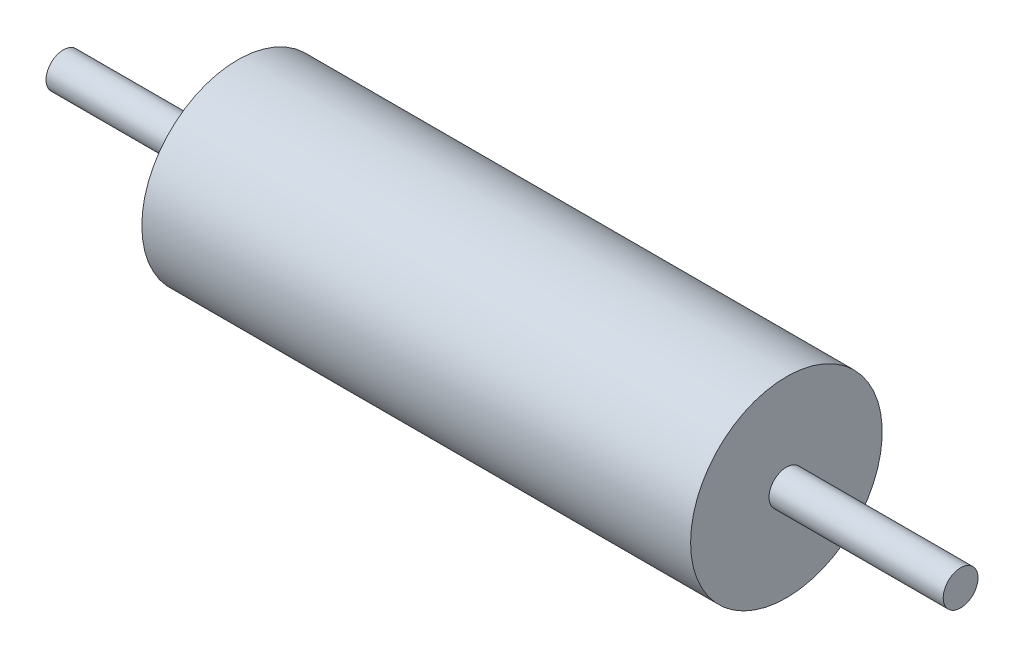
ISO-10303-21;
HEADER;
FILE_DESCRIPTION(('STEP AP214'),'2;1');
FILE_NAME('part.step','',(''),(''),'','','');
FILE_SCHEMA(('AUTOMOTIVE_DESIGN { 1 0 10303 214 1 1 1 1 }'));
ENDSEC;
DATA;
#1=APPLICATION_CONTEXT('core data for automotive mechanical design processes');
#2=APPLICATION_PROTOCOL_DEFINITION('international standard','automotive_design',2000,#1);
#3=PRODUCT_CONTEXT('',#1,'mechanical');
#4=PRODUCT('Part','Part','',(#3));
#5=PRODUCT_RELATED_PRODUCT_CATEGORY('part','',(#4));
#6=PRODUCT_DEFINITION_FORMATION('','',#4);
#7=PRODUCT_DEFINITION_CONTEXT('part definition',#1,'design');
#8=PRODUCT_DEFINITION('design','',#6,#7);
#9=PRODUCT_DEFINITION_SHAPE('','',#8);
#10=(LENGTH_UNIT() NAMED_UNIT(*) SI_UNIT(.MILLI.,.METRE.));
#11=(NAMED_UNIT(*) PLANE_ANGLE_UNIT() SI_UNIT($,.RADIAN.));
#12=(NAMED_UNIT(*) SI_UNIT($,.STERADIAN.) SOLID_ANGLE_UNIT());
#13=UNCERTAINTY_MEASURE_WITH_UNIT(LENGTH_MEASURE(1.E-05),#10,'distance_accuracy_value','');
#14=(GEOMETRIC_REPRESENTATION_CONTEXT(3) GLOBAL_UNCERTAINTY_ASSIGNED_CONTEXT((#13)) GLOBAL_UNIT_ASSIGNED_CONTEXT((#10,
#11,#12)) REPRESENTATION_CONTEXT('',''));
#15=CARTESIAN_POINT('',(0.,0.,0.));
#16=DIRECTION('',(0.,0.,1.));
#17=DIRECTION('',(1.,0.,0.));
#18=AXIS2_PLACEMENT_3D('',#15,#16,#17);
#19=CARTESIAN_POINT('',(2.,0.,-0.200000000000001));
#20=DIRECTION('',(-1.,0.,0.));
#21=DIRECTION('',(0.,0.,1.));
#22=AXIS2_PLACEMENT_3D('',#19,#20,#21);
#23=PLANE('',#22);
#24=CARTESIAN_POINT('',(2.,0.,0.));
#25=DIRECTION('',(-1.,0.,0.));
#26=DIRECTION('',(0.,0.,1.));
#27=AXIS2_PLACEMENT_3D('',#24,#25,#26);
#28=CIRCLE('',#27,0.200000000000001);
#29=CARTESIAN_POINT('',(2.,0.,0.200000000000001));
#30=VERTEX_POINT('',#29);
#31=EDGE_CURVE('E55',#30,#30,#28,.T.);
#32=ORIENTED_EDGE('',*,*,#31,.F.);
#33=EDGE_LOOP('',(#32));
#34=FACE_BOUND('',#33,.T.);
#35=ADVANCED_FACE('F33',(#34),#23,.F.);
#36=CARTESIAN_POINT('',(-8.3,0.,-0.2));
#37=DIRECTION('',(1.,0.,0.));
#38=DIRECTION('',(0.,0.,-1.));
#39=AXIS2_PLACEMENT_3D('',#36,#37,#38);
#40=PLANE('',#39);
#41=CARTESIAN_POINT('',(-8.3,0.,0.));
#42=DIRECTION('',(-1.,0.,0.));
#43=DIRECTION('',(0.,0.,1.));
#44=AXIS2_PLACEMENT_3D('',#41,#42,#43);
#45=CIRCLE('',#44,0.2);
#46=CARTESIAN_POINT('',(-8.3,0.,0.2));
#47=VERTEX_POINT('',#46);
#48=EDGE_CURVE('E10',#47,#47,#45,.T.);
#49=ORIENTED_EDGE('',*,*,#48,.T.);
#50=EDGE_LOOP('',(#49));
#51=FACE_BOUND('',#50,.T.);
#52=ADVANCED_FACE('F62',(#51),#40,.F.);
#53=CARTESIAN_POINT('',(0.,0.,0.));
#54=DIRECTION('',(-1.,0.,0.));
#55=DIRECTION('',(0.,0.,1.));
#56=AXIS2_PLACEMENT_3D('',#53,#54,#55);
#57=CYLINDRICAL_SURFACE('',#56,0.2);
#58=ORIENTED_EDGE('',*,*,#48,.F.);
#59=EDGE_LOOP('',(#58));
#60=FACE_BOUND('',#59,.T.);
#61=CARTESIAN_POINT('',(-6.3,0.,0.));
#62=DIRECTION('',(-1.,0.,0.));
#63=DIRECTION('',(0.,0.,1.));
#64=AXIS2_PLACEMENT_3D('',#61,#62,#63);
#65=CIRCLE('',#64,0.2);
#66=CARTESIAN_POINT('',(-6.3,0.,0.2));
#67=VERTEX_POINT('',#66);
#68=EDGE_CURVE('E39',#67,#67,#65,.T.);
#69=ORIENTED_EDGE('',*,*,#68,.T.);
#70=EDGE_LOOP('',(#69));
#71=FACE_BOUND('',#70,.T.);
#72=ADVANCED_FACE('F66',(#60,#71),#57,.T.);
#73=CARTESIAN_POINT('',(-6.3,0.,-1.1));
#74=DIRECTION('',(1.,0.,0.));
#75=DIRECTION('',(0.,0.,-1.));
#76=AXIS2_PLACEMENT_3D('',#73,#74,#75);
#77=PLANE('',#76);
#78=ORIENTED_EDGE('',*,*,#68,.F.);
#79=EDGE_LOOP('',(#78));
#80=FACE_BOUND('',#79,.T.);
#81=CARTESIAN_POINT('',(-6.3,0.,0.));
#82=DIRECTION('',(-1.,0.,0.));
#83=DIRECTION('',(0.,0.,1.));
#84=AXIS2_PLACEMENT_3D('',#81,#82,#83);
#85=CIRCLE('',#84,1.1);
#86=CARTESIAN_POINT('',(-6.3,0.,1.1));
#87=VERTEX_POINT('',#86);
#88=EDGE_CURVE('E43',#87,#87,#85,.T.);
#89=ORIENTED_EDGE('',*,*,#88,.T.);
#90=EDGE_LOOP('',(#89));
#91=FACE_BOUND('',#90,.T.);
#92=ADVANCED_FACE('F70',(#80,#91),#77,.F.);
#93=CARTESIAN_POINT('',(0.,0.,0.));
#94=DIRECTION('',(-1.,0.,0.));
#95=DIRECTION('',(0.,0.,1.));
#96=AXIS2_PLACEMENT_3D('',#93,#94,#95);
#97=CYLINDRICAL_SURFACE('',#96,1.1);
#98=ORIENTED_EDGE('',*,*,#88,.F.);
#99=EDGE_LOOP('',(#98));
#100=FACE_BOUND('',#99,.T.);
#101=CARTESIAN_POINT('',(0.,0.,0.));
#102=DIRECTION('',(-1.,0.,0.));
#103=DIRECTION('',(0.,0.,1.));
#104=AXIS2_PLACEMENT_3D('',#101,#102,#103);
#105=CIRCLE('',#104,1.1);
#106=CARTESIAN_POINT('',(0.,0.,1.1));
#107=VERTEX_POINT('',#106);
#108=EDGE_CURVE('E47',#107,#107,#105,.T.);
#109=ORIENTED_EDGE('',*,*,#108,.T.);
#110=EDGE_LOOP('',(#109));
#111=FACE_BOUND('',#110,.T.);
#112=ADVANCED_FACE('F76',(#100,#111),#97,.T.);
#113=CARTESIAN_POINT('',(0.,0.,-1.1));
#114=DIRECTION('',(-1.,0.,0.));
#115=DIRECTION('',(0.,0.,1.));
#116=AXIS2_PLACEMENT_3D('',#113,#114,#115);
#117=PLANE('',#116);
#118=ORIENTED_EDGE('',*,*,#108,.F.);
#119=EDGE_LOOP('',(#118));
#120=FACE_BOUND('',#119,.T.);
#121=CARTESIAN_POINT('',(0.,0.,0.));
#122=DIRECTION('',(-1.,0.,0.));
#123=DIRECTION('',(0.,0.,1.));
#124=AXIS2_PLACEMENT_3D('',#121,#122,#123);
#125=CIRCLE('',#124,0.200000000000001);
#126=CARTESIAN_POINT('',(0.,0.,0.200000000000001));
#127=VERTEX_POINT('',#126);
#128=EDGE_CURVE('E52',#127,#127,#125,.T.);
#129=ORIENTED_EDGE('',*,*,#128,.T.);
#130=EDGE_LOOP('',(#129));
#131=FACE_BOUND('',#130,.T.);
#132=ADVANCED_FACE('F80',(#120,#131),#117,.F.);
#133=CARTESIAN_POINT('',(0.,0.,0.));
#134=DIRECTION('',(-1.,0.,0.));
#135=DIRECTION('',(0.,0.,1.));
#136=AXIS2_PLACEMENT_3D('',#133,#134,#135);
#137=CYLINDRICAL_SURFACE('',#136,0.200000000000001);
#138=ORIENTED_EDGE('',*,*,#128,.F.);
#139=EDGE_LOOP('',(#138));
#140=FACE_BOUND('',#139,.T.);
#141=ORIENTED_EDGE('',*,*,#31,.T.);
#142=EDGE_LOOP('',(#141));
#143=FACE_BOUND('',#142,.T.);
#144=ADVANCED_FACE('F59',(#140,#143),#137,.T.);
#145=CLOSED_SHELL('',(#35,#52,#72,#92,#112,#132,#144));
#146=MANIFOLD_SOLID_BREP('B2',#145);
#147=ADVANCED_BREP_SHAPE_REPRESENTATION('',(#18,#146),#14);
#148=SHAPE_DEFINITION_REPRESENTATION(#9,#147);
ENDSEC;
END-ISO-10303-21;
